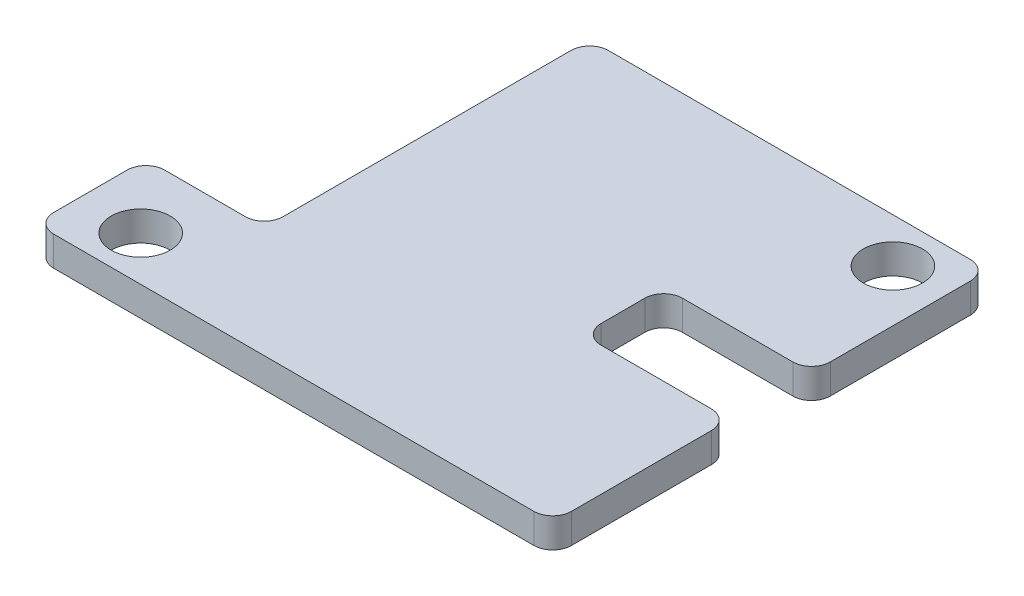
ISO-10303-21;
HEADER;
FILE_DESCRIPTION(('STEP AP214'),'2;1');
FILE_NAME('part.step','',(''),(''),'','','');
FILE_SCHEMA(('AUTOMOTIVE_DESIGN { 1 0 10303 214 1 1 1 1 }'));
ENDSEC;
DATA;
#1=APPLICATION_CONTEXT('core data for automotive mechanical design processes');
#2=APPLICATION_PROTOCOL_DEFINITION('international standard','automotive_design',2000,#1);
#3=PRODUCT_CONTEXT('',#1,'mechanical');
#4=PRODUCT('Part','Part','',(#3));
#5=PRODUCT_RELATED_PRODUCT_CATEGORY('part','',(#4));
#6=PRODUCT_DEFINITION_FORMATION('','',#4);
#7=PRODUCT_DEFINITION_CONTEXT('part definition',#1,'design');
#8=PRODUCT_DEFINITION('design','',#6,#7);
#9=PRODUCT_DEFINITION_SHAPE('','',#8);
#10=(LENGTH_UNIT() NAMED_UNIT(*) SI_UNIT(.MILLI.,.METRE.));
#11=(NAMED_UNIT(*) PLANE_ANGLE_UNIT() SI_UNIT($,.RADIAN.));
#12=(NAMED_UNIT(*) SI_UNIT($,.STERADIAN.) SOLID_ANGLE_UNIT());
#13=UNCERTAINTY_MEASURE_WITH_UNIT(LENGTH_MEASURE(1.E-05),#10,'distance_accuracy_value','');
#14=(GEOMETRIC_REPRESENTATION_CONTEXT(3) GLOBAL_UNCERTAINTY_ASSIGNED_CONTEXT((#13)) GLOBAL_UNIT_ASSIGNED_CONTEXT((#10,
#11,#12)) REPRESENTATION_CONTEXT('',''));
#15=CARTESIAN_POINT('',(0.,0.,0.));
#16=DIRECTION('',(0.,0.,1.));
#17=DIRECTION('',(1.,0.,0.));
#18=AXIS2_PLACEMENT_3D('',#15,#16,#17);
#19=CARTESIAN_POINT('',(0.,2.,0.));
#20=DIRECTION('',(0.,1.,0.));
#21=DIRECTION('',(0.,0.,1.));
#22=AXIS2_PLACEMENT_3D('',#19,#20,#21);
#23=PLANE('',#22);
#24=CARTESIAN_POINT('',(4.15,2.,-3.));
#25=DIRECTION('',(0.,1.,0.));
#26=DIRECTION('',(0.,0.,1.));
#27=AXIS2_PLACEMENT_3D('',#24,#25,#26);
#28=CIRCLE('',#27,2.);
#29=CARTESIAN_POINT('',(4.15,2.,-0.999999999999999));
#30=VERTEX_POINT('',#29);
#31=EDGE_CURVE('E328',#30,#30,#28,.T.);
#32=ORIENTED_EDGE('',*,*,#31,.F.);
#33=EDGE_LOOP('',(#32));
#34=FACE_BOUND('',#33,.T.);
#35=DIRECTION('',(-1.,0.,0.));
#36=VECTOR('',#35,1.);
#37=CARTESIAN_POINT('',(8.,2.,-29.5));
#38=LINE('',#37,#36);
#39=CARTESIAN_POINT('',(33.73,2.,-29.5));
#40=VERTEX_POINT('',#39);
#41=CARTESIAN_POINT('',(9.27,2.,-29.5));
#42=VERTEX_POINT('',#41);
#43=EDGE_CURVE('E320',#40,#42,#38,.T.);
#44=ORIENTED_EDGE('',*,*,#43,.T.);
#45=CARTESIAN_POINT('',(9.27,2.,-28.23));
#46=DIRECTION('',(0.,1.,0.));
#47=DIRECTION('',(0.,0.,1.));
#48=AXIS2_PLACEMENT_3D('',#45,#46,#47);
#49=CIRCLE('',#48,1.27);
#50=CARTESIAN_POINT('',(8.,2.,-28.23));
#51=VERTEX_POINT('',#50);
#52=EDGE_CURVE('E278',#42,#51,#49,.T.);
#53=ORIENTED_EDGE('',*,*,#52,.T.);
#54=DIRECTION('',(0.,0.,1.));
#55=VECTOR('',#54,1.);
#56=CARTESIAN_POINT('',(8.,2.,-29.5));
#57=LINE('',#56,#55);
#58=CARTESIAN_POINT('',(8.,2.,-8.77));
#59=VERTEX_POINT('',#58);
#60=EDGE_CURVE('E318',#51,#59,#57,.T.);
#61=ORIENTED_EDGE('',*,*,#60,.T.);
#62=CARTESIAN_POINT('',(6.73,2.,-8.77));
#63=DIRECTION('',(0.,1.,0.));
#64=DIRECTION('',(0.,0.,1.));
#65=AXIS2_PLACEMENT_3D('',#62,#63,#64);
#66=CIRCLE('',#65,1.27);
#67=CARTESIAN_POINT('',(6.73,2.,-7.5));
#68=VERTEX_POINT('',#67);
#69=EDGE_CURVE('E13',#59,#68,#66,.F.);
#70=ORIENTED_EDGE('',*,*,#69,.T.);
#71=DIRECTION('',(-1.,0.,0.));
#72=VECTOR('',#71,1.);
#73=CARTESIAN_POINT('',(8.,2.,-7.5));
#74=LINE('',#73,#72);
#75=CARTESIAN_POINT('',(1.27,2.,-7.5));
#76=VERTEX_POINT('',#75);
#77=EDGE_CURVE('E233',#68,#76,#74,.T.);
#78=ORIENTED_EDGE('',*,*,#77,.T.);
#79=CARTESIAN_POINT('',(1.27,2.,-6.23));
#80=DIRECTION('',(0.,1.,0.));
#81=DIRECTION('',(0.,0.,1.));
#82=AXIS2_PLACEMENT_3D('',#79,#80,#81);
#83=CIRCLE('',#82,1.27);
#84=CARTESIAN_POINT('',(0.,2.,-6.23));
#85=VERTEX_POINT('',#84);
#86=EDGE_CURVE('E276',#76,#85,#83,.T.);
#87=ORIENTED_EDGE('',*,*,#86,.T.);
#88=DIRECTION('',(0.,0.,1.));
#89=VECTOR('',#88,1.);
#90=CARTESIAN_POINT('',(0.,2.,0.));
#91=LINE('',#90,#89);
#92=CARTESIAN_POINT('',(0.,2.,-1.27));
#93=VERTEX_POINT('',#92);
#94=EDGE_CURVE('E232',#85,#93,#91,.T.);
#95=ORIENTED_EDGE('',*,*,#94,.T.);
#96=CARTESIAN_POINT('',(1.27,2.,-1.27));
#97=DIRECTION('',(0.,1.,0.));
#98=DIRECTION('',(0.,0.,1.));
#99=AXIS2_PLACEMENT_3D('',#96,#97,#98);
#100=CIRCLE('',#99,1.27);
#101=CARTESIAN_POINT('',(1.27,2.,0.));
#102=VERTEX_POINT('',#101);
#103=EDGE_CURVE('E268',#93,#102,#100,.T.);
#104=ORIENTED_EDGE('',*,*,#103,.T.);
#105=DIRECTION('',(1.,0.,0.));
#106=VECTOR('',#105,1.);
#107=CARTESIAN_POINT('',(0.,2.,0.));
#108=LINE('',#107,#106);
#109=CARTESIAN_POINT('',(33.73,2.,0.));
#110=VERTEX_POINT('',#109);
#111=EDGE_CURVE('E456',#102,#110,#108,.T.);
#112=ORIENTED_EDGE('',*,*,#111,.T.);
#113=CARTESIAN_POINT('',(33.73,2.,-1.27));
#114=DIRECTION('',(0.,1.,0.));
#115=DIRECTION('',(0.,0.,1.));
#116=AXIS2_PLACEMENT_3D('',#113,#114,#115);
#117=CIRCLE('',#116,1.27);
#118=CARTESIAN_POINT('',(35.,2.,-1.27));
#119=VERTEX_POINT('',#118);
#120=EDGE_CURVE('E274',#110,#119,#117,.T.);
#121=ORIENTED_EDGE('',*,*,#120,.T.);
#122=DIRECTION('',(0.,0.,-1.));
#123=VECTOR('',#122,1.);
#124=CARTESIAN_POINT('',(35.,2.,0.));
#125=LINE('',#124,#123);
#126=CARTESIAN_POINT('',(35.,2.,-10.73));
#127=VERTEX_POINT('',#126);
#128=EDGE_CURVE('E356',#119,#127,#125,.T.);
#129=ORIENTED_EDGE('',*,*,#128,.T.);
#130=CARTESIAN_POINT('',(33.73,2.,-10.73));
#131=DIRECTION('',(0.,1.,0.));
#132=DIRECTION('',(0.,0.,1.));
#133=AXIS2_PLACEMENT_3D('',#130,#131,#132);
#134=CIRCLE('',#133,1.27);
#135=CARTESIAN_POINT('',(33.73,2.,-12.));
#136=VERTEX_POINT('',#135);
#137=EDGE_CURVE('E272',#127,#136,#134,.T.);
#138=ORIENTED_EDGE('',*,*,#137,.T.);
#139=DIRECTION('',(-1.,0.,0.));
#140=VECTOR('',#139,1.);
#141=CARTESIAN_POINT('',(25.,2.,-12.));
#142=LINE('',#141,#140);
#143=CARTESIAN_POINT('',(26.27,2.,-12.));
#144=VERTEX_POINT('',#143);
#145=EDGE_CURVE('E350',#136,#144,#142,.T.);
#146=ORIENTED_EDGE('',*,*,#145,.T.);
#147=CARTESIAN_POINT('',(26.27,2.,-13.27));
#148=DIRECTION('',(0.,1.,0.));
#149=DIRECTION('',(0.,0.,1.));
#150=AXIS2_PLACEMENT_3D('',#147,#148,#149);
#151=CIRCLE('',#150,1.27);
#152=CARTESIAN_POINT('',(25.,2.,-13.27));
#153=VERTEX_POINT('',#152);
#154=EDGE_CURVE('E306',#144,#153,#151,.F.);
#155=ORIENTED_EDGE('',*,*,#154,.T.);
#156=DIRECTION('',(0.,0.,-1.));
#157=VECTOR('',#156,1.);
#158=CARTESIAN_POINT('',(25.,2.,-17.5));
#159=LINE('',#158,#157);
#160=CARTESIAN_POINT('',(25.,2.,-16.23));
#161=VERTEX_POINT('',#160);
#162=EDGE_CURVE('E349',#153,#161,#159,.T.);
#163=ORIENTED_EDGE('',*,*,#162,.T.);
#164=CARTESIAN_POINT('',(26.27,2.,-16.23));
#165=DIRECTION('',(0.,1.,0.));
#166=DIRECTION('',(0.,0.,1.));
#167=AXIS2_PLACEMENT_3D('',#164,#165,#166);
#168=CIRCLE('',#167,1.27);
#169=CARTESIAN_POINT('',(26.27,2.,-17.5));
#170=VERTEX_POINT('',#169);
#171=EDGE_CURVE('E196',#161,#170,#168,.F.);
#172=ORIENTED_EDGE('',*,*,#171,.T.);
#173=DIRECTION('',(1.,0.,0.));
#174=VECTOR('',#173,1.);
#175=CARTESIAN_POINT('',(35.,2.,-17.5));
#176=LINE('',#175,#174);
#177=CARTESIAN_POINT('',(33.73,2.,-17.5));
#178=VERTEX_POINT('',#177);
#179=EDGE_CURVE('E206',#170,#178,#176,.T.);
#180=ORIENTED_EDGE('',*,*,#179,.T.);
#181=CARTESIAN_POINT('',(33.73,2.,-18.77));
#182=DIRECTION('',(0.,1.,0.));
#183=DIRECTION('',(0.,0.,1.));
#184=AXIS2_PLACEMENT_3D('',#181,#182,#183);
#185=CIRCLE('',#184,1.27);
#186=CARTESIAN_POINT('',(35.,2.,-18.77));
#187=VERTEX_POINT('',#186);
#188=EDGE_CURVE('E270',#178,#187,#185,.T.);
#189=ORIENTED_EDGE('',*,*,#188,.T.);
#190=DIRECTION('',(0.,0.,-1.));
#191=VECTOR('',#190,1.);
#192=CARTESIAN_POINT('',(35.,2.,-17.5));
#193=LINE('',#192,#191);
#194=CARTESIAN_POINT('',(35.,2.,-28.23));
#195=VERTEX_POINT('',#194);
#196=EDGE_CURVE('E354',#187,#195,#193,.T.);
#197=ORIENTED_EDGE('',*,*,#196,.T.);
#198=CARTESIAN_POINT('',(33.73,2.,-28.23));
#199=DIRECTION('',(0.,1.,0.));
#200=DIRECTION('',(0.,0.,1.));
#201=AXIS2_PLACEMENT_3D('',#198,#199,#200);
#202=CIRCLE('',#201,1.27);
#203=EDGE_CURVE('E266',#195,#40,#202,.T.);
#204=ORIENTED_EDGE('',*,*,#203,.T.);
#205=EDGE_LOOP('',(#44,#53,#61,#70,#78,#87,#95,#104,#112,#121,#129,#138,#146,#155,#163,#172,
#180,#189,#197,#204));
#206=FACE_BOUND('',#205,.T.);
#207=CARTESIAN_POINT('',(31.5,2.,-26.5));
#208=DIRECTION('',(0.,1.,0.));
#209=DIRECTION('',(0.,0.,1.));
#210=AXIS2_PLACEMENT_3D('',#207,#208,#209);
#211=CIRCLE('',#210,2.);
#212=CARTESIAN_POINT('',(31.5,2.,-24.5));
#213=VERTEX_POINT('',#212);
#214=EDGE_CURVE('E466',#213,#213,#211,.T.);
#215=ORIENTED_EDGE('',*,*,#214,.F.);
#216=EDGE_LOOP('',(#215));
#217=FACE_BOUND('',#216,.T.);
#218=ADVANCED_FACE('F49',(#34,#206,#217),#23,.T.);
#219=CARTESIAN_POINT('',(0.,0.,0.));
#220=DIRECTION('',(0.,1.,0.));
#221=DIRECTION('',(0.,0.,1.));
#222=AXIS2_PLACEMENT_3D('',#219,#220,#221);
#223=PLANE('',#222);
#224=CARTESIAN_POINT('',(4.15,0.,-3.));
#225=DIRECTION('',(0.,1.,0.));
#226=DIRECTION('',(0.,0.,1.));
#227=AXIS2_PLACEMENT_3D('',#224,#225,#226);
#228=CIRCLE('',#227,2.);
#229=CARTESIAN_POINT('',(4.15,0.,-0.999999999999999));
#230=VERTEX_POINT('',#229);
#231=EDGE_CURVE('E463',#230,#230,#228,.T.);
#232=ORIENTED_EDGE('',*,*,#231,.T.);
#233=EDGE_LOOP('',(#232));
#234=FACE_BOUND('',#233,.T.);
#235=DIRECTION('',(0.,0.,1.));
#236=VECTOR('',#235,1.);
#237=CARTESIAN_POINT('',(8.,0.,-29.5));
#238=LINE('',#237,#236);
#239=CARTESIAN_POINT('',(8.,0.,-28.23));
#240=VERTEX_POINT('',#239);
#241=CARTESIAN_POINT('',(8.,0.,-8.77));
#242=VERTEX_POINT('',#241);
#243=EDGE_CURVE('E227',#240,#242,#238,.T.);
#244=ORIENTED_EDGE('',*,*,#243,.F.);
#245=CARTESIAN_POINT('',(9.27,0.,-28.23));
#246=DIRECTION('',(0.,1.,0.));
#247=DIRECTION('',(0.,0.,1.));
#248=AXIS2_PLACEMENT_3D('',#245,#246,#247);
#249=CIRCLE('',#248,1.27);
#250=CARTESIAN_POINT('',(9.27,0.,-29.5));
#251=VERTEX_POINT('',#250);
#252=EDGE_CURVE('E259',#240,#251,#249,.F.);
#253=ORIENTED_EDGE('',*,*,#252,.T.);
#254=DIRECTION('',(-1.,0.,0.));
#255=VECTOR('',#254,1.);
#256=CARTESIAN_POINT('',(8.,0.,-29.5));
#257=LINE('',#256,#255);
#258=CARTESIAN_POINT('',(33.73,0.,-29.5));
#259=VERTEX_POINT('',#258);
#260=EDGE_CURVE('E219',#259,#251,#257,.T.);
#261=ORIENTED_EDGE('',*,*,#260,.F.);
#262=CARTESIAN_POINT('',(33.73,0.,-28.23));
#263=DIRECTION('',(0.,1.,0.));
#264=DIRECTION('',(0.,0.,1.));
#265=AXIS2_PLACEMENT_3D('',#262,#263,#264);
#266=CIRCLE('',#265,1.27);
#267=CARTESIAN_POINT('',(35.,0.,-28.23));
#268=VERTEX_POINT('',#267);
#269=EDGE_CURVE('E248',#259,#268,#266,.F.);
#270=ORIENTED_EDGE('',*,*,#269,.T.);
#271=DIRECTION('',(0.,0.,-1.));
#272=VECTOR('',#271,1.);
#273=CARTESIAN_POINT('',(35.,0.,-17.5));
#274=LINE('',#273,#272);
#275=CARTESIAN_POINT('',(35.,0.,-18.77));
#276=VERTEX_POINT('',#275);
#277=EDGE_CURVE('E215',#276,#268,#274,.T.);
#278=ORIENTED_EDGE('',*,*,#277,.F.);
#279=CARTESIAN_POINT('',(33.73,0.,-18.77));
#280=DIRECTION('',(0.,1.,0.));
#281=DIRECTION('',(0.,0.,1.));
#282=AXIS2_PLACEMENT_3D('',#279,#280,#281);
#283=CIRCLE('',#282,1.27);
#284=CARTESIAN_POINT('',(33.73,0.,-17.5));
#285=VERTEX_POINT('',#284);
#286=EDGE_CURVE('E214',#276,#285,#283,.F.);
#287=ORIENTED_EDGE('',*,*,#286,.T.);
#288=DIRECTION('',(1.,0.,0.));
#289=VECTOR('',#288,1.);
#290=CARTESIAN_POINT('',(35.,0.,-17.5));
#291=LINE('',#290,#289);
#292=CARTESIAN_POINT('',(26.27,0.,-17.5));
#293=VERTEX_POINT('',#292);
#294=EDGE_CURVE('E203',#293,#285,#291,.T.);
#295=ORIENTED_EDGE('',*,*,#294,.F.);
#296=CARTESIAN_POINT('',(26.27,0.,-16.23));
#297=DIRECTION('',(0.,1.,0.));
#298=DIRECTION('',(0.,0.,1.));
#299=AXIS2_PLACEMENT_3D('',#296,#297,#298);
#300=CIRCLE('',#299,1.27);
#301=CARTESIAN_POINT('',(25.,0.,-16.23));
#302=VERTEX_POINT('',#301);
#303=EDGE_CURVE('E186',#293,#302,#300,.T.);
#304=ORIENTED_EDGE('',*,*,#303,.T.);
#305=DIRECTION('',(0.,0.,-1.));
#306=VECTOR('',#305,1.);
#307=CARTESIAN_POINT('',(25.,0.,-17.5));
#308=LINE('',#307,#306);
#309=CARTESIAN_POINT('',(25.,0.,-13.27));
#310=VERTEX_POINT('',#309);
#311=EDGE_CURVE('E216',#310,#302,#308,.T.);
#312=ORIENTED_EDGE('',*,*,#311,.F.);
#313=CARTESIAN_POINT('',(26.27,0.,-13.27));
#314=DIRECTION('',(0.,1.,0.));
#315=DIRECTION('',(0.,0.,1.));
#316=AXIS2_PLACEMENT_3D('',#313,#314,#315);
#317=CIRCLE('',#316,1.27);
#318=CARTESIAN_POINT('',(26.27,0.,-12.));
#319=VERTEX_POINT('',#318);
#320=EDGE_CURVE('E304',#310,#319,#317,.T.);
#321=ORIENTED_EDGE('',*,*,#320,.T.);
#322=DIRECTION('',(-1.,0.,0.));
#323=VECTOR('',#322,1.);
#324=CARTESIAN_POINT('',(25.,0.,-12.));
#325=LINE('',#324,#323);
#326=CARTESIAN_POINT('',(33.73,0.,-12.));
#327=VERTEX_POINT('',#326);
#328=EDGE_CURVE('E221',#327,#319,#325,.T.);
#329=ORIENTED_EDGE('',*,*,#328,.F.);
#330=CARTESIAN_POINT('',(33.73,0.,-10.73));
#331=DIRECTION('',(0.,1.,0.));
#332=DIRECTION('',(0.,0.,1.));
#333=AXIS2_PLACEMENT_3D('',#330,#331,#332);
#334=CIRCLE('',#333,1.27);
#335=CARTESIAN_POINT('',(35.,0.,-10.73));
#336=VERTEX_POINT('',#335);
#337=EDGE_CURVE('E253',#327,#336,#334,.F.);
#338=ORIENTED_EDGE('',*,*,#337,.T.);
#339=DIRECTION('',(0.,0.,-1.));
#340=VECTOR('',#339,1.);
#341=CARTESIAN_POINT('',(35.,0.,0.));
#342=LINE('',#341,#340);
#343=CARTESIAN_POINT('',(35.,0.,-1.27));
#344=VERTEX_POINT('',#343);
#345=EDGE_CURVE('E331',#344,#336,#342,.T.);
#346=ORIENTED_EDGE('',*,*,#345,.F.);
#347=CARTESIAN_POINT('',(33.73,0.,-1.27));
#348=DIRECTION('',(0.,1.,0.));
#349=DIRECTION('',(0.,0.,1.));
#350=AXIS2_PLACEMENT_3D('',#347,#348,#349);
#351=CIRCLE('',#350,1.27);
#352=CARTESIAN_POINT('',(33.73,0.,0.));
#353=VERTEX_POINT('',#352);
#354=EDGE_CURVE('E255',#344,#353,#351,.F.);
#355=ORIENTED_EDGE('',*,*,#354,.T.);
#356=DIRECTION('',(1.,0.,0.));
#357=VECTOR('',#356,1.);
#358=CARTESIAN_POINT('',(0.,0.,0.));
#359=LINE('',#358,#357);
#360=CARTESIAN_POINT('',(1.27,0.,0.));
#361=VERTEX_POINT('',#360);
#362=EDGE_CURVE('E327',#361,#353,#359,.T.);
#363=ORIENTED_EDGE('',*,*,#362,.F.);
#364=CARTESIAN_POINT('',(1.27,0.,-1.27));
#365=DIRECTION('',(0.,1.,0.));
#366=DIRECTION('',(0.,0.,1.));
#367=AXIS2_PLACEMENT_3D('',#364,#365,#366);
#368=CIRCLE('',#367,1.27);
#369=CARTESIAN_POINT('',(0.,0.,-1.27));
#370=VERTEX_POINT('',#369);
#371=EDGE_CURVE('E250',#361,#370,#368,.F.);
#372=ORIENTED_EDGE('',*,*,#371,.T.);
#373=DIRECTION('',(0.,0.,1.));
#374=VECTOR('',#373,1.);
#375=CARTESIAN_POINT('',(0.,0.,0.));
#376=LINE('',#375,#374);
#377=CARTESIAN_POINT('',(0.,0.,-6.23));
#378=VERTEX_POINT('',#377);
#379=EDGE_CURVE('E324',#378,#370,#376,.T.);
#380=ORIENTED_EDGE('',*,*,#379,.F.);
#381=CARTESIAN_POINT('',(1.27,0.,-6.23));
#382=DIRECTION('',(0.,1.,0.));
#383=DIRECTION('',(0.,0.,1.));
#384=AXIS2_PLACEMENT_3D('',#381,#382,#383);
#385=CIRCLE('',#384,1.27);
#386=CARTESIAN_POINT('',(1.27,0.,-7.5));
#387=VERTEX_POINT('',#386);
#388=EDGE_CURVE('E257',#378,#387,#385,.F.);
#389=ORIENTED_EDGE('',*,*,#388,.T.);
#390=DIRECTION('',(-1.,0.,0.));
#391=VECTOR('',#390,1.);
#392=CARTESIAN_POINT('',(8.,0.,-7.5));
#393=LINE('',#392,#391);
#394=CARTESIAN_POINT('',(6.73,0.,-7.5));
#395=VERTEX_POINT('',#394);
#396=EDGE_CURVE('E230',#395,#387,#393,.T.);
#397=ORIENTED_EDGE('',*,*,#396,.F.);
#398=CARTESIAN_POINT('',(6.73,0.,-8.77));
#399=DIRECTION('',(0.,1.,0.));
#400=DIRECTION('',(0.,0.,1.));
#401=AXIS2_PLACEMENT_3D('',#398,#399,#400);
#402=CIRCLE('',#401,1.27);
#403=EDGE_CURVE('E57',#395,#242,#402,.T.);
#404=ORIENTED_EDGE('',*,*,#403,.T.);
#405=EDGE_LOOP('',(#244,#253,#261,#270,#278,#287,#295,#304,#312,#321,#329,#338,#346,#355,#363,
#372,#380,#389,#397,#404));
#406=FACE_BOUND('',#405,.T.);
#407=CARTESIAN_POINT('',(31.5,0.,-26.5));
#408=DIRECTION('',(0.,1.,0.));
#409=DIRECTION('',(0.,0.,1.));
#410=AXIS2_PLACEMENT_3D('',#407,#408,#409);
#411=CIRCLE('',#410,2.);
#412=CARTESIAN_POINT('',(31.5,0.,-24.5));
#413=VERTEX_POINT('',#412);
#414=EDGE_CURVE('E469',#413,#413,#411,.T.);
#415=ORIENTED_EDGE('',*,*,#414,.T.);
#416=EDGE_LOOP('',(#415));
#417=FACE_BOUND('',#416,.T.);
#418=ADVANCED_FACE('F211',(#234,#406,#417),#223,.F.);
#419=CARTESIAN_POINT('',(0.,2.,0.));
#420=DIRECTION('',(1.,0.,0.));
#421=DIRECTION('',(0.,0.,-1.));
#422=AXIS2_PLACEMENT_3D('',#419,#420,#421);
#423=PLANE('',#422);
#424=ORIENTED_EDGE('',*,*,#94,.F.);
#425=DIRECTION('',(0.,-1.,0.));
#426=VECTOR('',#425,1.);
#427=CARTESIAN_POINT('',(0.,2.,-6.23));
#428=LINE('',#427,#426);
#429=EDGE_CURVE('E286',#85,#378,#428,.T.);
#430=ORIENTED_EDGE('',*,*,#429,.T.);
#431=ORIENTED_EDGE('',*,*,#379,.T.);
#432=DIRECTION('',(0.,-1.,0.));
#433=VECTOR('',#432,1.);
#434=CARTESIAN_POINT('',(0.,2.,-1.27));
#435=LINE('',#434,#433);
#436=EDGE_CURVE('E284',#370,#93,#435,.F.);
#437=ORIENTED_EDGE('',*,*,#436,.T.);
#438=EDGE_LOOP('',(#424,#430,#431,#437));
#439=FACE_BOUND('',#438,.T.);
#440=ADVANCED_FACE('F398',(#439),#423,.F.);
#441=CARTESIAN_POINT('',(0.,2.,0.));
#442=DIRECTION('',(0.,0.,-1.));
#443=DIRECTION('',(-1.,0.,0.));
#444=AXIS2_PLACEMENT_3D('',#441,#442,#443);
#445=PLANE('',#444);
#446=ORIENTED_EDGE('',*,*,#362,.T.);
#447=DIRECTION('',(0.,-1.,0.));
#448=VECTOR('',#447,1.);
#449=CARTESIAN_POINT('',(33.73,2.,0.));
#450=LINE('',#449,#448);
#451=EDGE_CURVE('E297',#353,#110,#450,.F.);
#452=ORIENTED_EDGE('',*,*,#451,.T.);
#453=ORIENTED_EDGE('',*,*,#111,.F.);
#454=DIRECTION('',(0.,-1.,0.));
#455=VECTOR('',#454,1.);
#456=CARTESIAN_POINT('',(1.27,2.,0.));
#457=LINE('',#456,#455);
#458=EDGE_CURVE('E294',#102,#361,#457,.T.);
#459=ORIENTED_EDGE('',*,*,#458,.T.);
#460=EDGE_LOOP('',(#446,#452,#453,#459));
#461=FACE_BOUND('',#460,.T.);
#462=ADVANCED_FACE('F423',(#461),#445,.F.);
#463=CARTESIAN_POINT('',(35.,2.,0.));
#464=DIRECTION('',(-1.,0.,0.));
#465=DIRECTION('',(0.,0.,1.));
#466=AXIS2_PLACEMENT_3D('',#463,#464,#465);
#467=PLANE('',#466);
#468=ORIENTED_EDGE('',*,*,#128,.F.);
#469=DIRECTION('',(0.,-1.,0.));
#470=VECTOR('',#469,1.);
#471=CARTESIAN_POINT('',(35.,2.,-1.27));
#472=LINE('',#471,#470);
#473=EDGE_CURVE('E291',#119,#344,#472,.T.);
#474=ORIENTED_EDGE('',*,*,#473,.T.);
#475=ORIENTED_EDGE('',*,*,#345,.T.);
#476=DIRECTION('',(0.,-1.,0.));
#477=VECTOR('',#476,1.);
#478=CARTESIAN_POINT('',(35.,2.,-10.73));
#479=LINE('',#478,#477);
#480=EDGE_CURVE('E289',#336,#127,#479,.F.);
#481=ORIENTED_EDGE('',*,*,#480,.T.);
#482=EDGE_LOOP('',(#468,#474,#475,#481));
#483=FACE_BOUND('',#482,.T.);
#484=ADVANCED_FACE('F420',(#483),#467,.F.);
#485=CARTESIAN_POINT('',(25.,2.,-12.));
#486=DIRECTION('',(0.,0.,1.));
#487=DIRECTION('',(1.,0.,0.));
#488=AXIS2_PLACEMENT_3D('',#485,#486,#487);
#489=PLANE('',#488);
#490=ORIENTED_EDGE('',*,*,#328,.T.);
#491=DIRECTION('',(0.,-1.,0.));
#492=VECTOR('',#491,1.);
#493=CARTESIAN_POINT('',(26.27,2.,-12.));
#494=LINE('',#493,#492);
#495=EDGE_CURVE('E241',#319,#144,#494,.F.);
#496=ORIENTED_EDGE('',*,*,#495,.T.);
#497=ORIENTED_EDGE('',*,*,#145,.F.);
#498=DIRECTION('',(0.,-1.,0.));
#499=VECTOR('',#498,1.);
#500=CARTESIAN_POINT('',(33.73,2.,-12.));
#501=LINE('',#500,#499);
#502=EDGE_CURVE('E238',#136,#327,#501,.T.);
#503=ORIENTED_EDGE('',*,*,#502,.T.);
#504=EDGE_LOOP('',(#490,#496,#497,#503));
#505=FACE_BOUND('',#504,.T.);
#506=ADVANCED_FACE('F337',(#505),#489,.F.);
#507=CARTESIAN_POINT('',(25.,2.,-17.5));
#508=DIRECTION('',(-1.,0.,0.));
#509=DIRECTION('',(0.,0.,1.));
#510=AXIS2_PLACEMENT_3D('',#507,#508,#509);
#511=PLANE('',#510);
#512=ORIENTED_EDGE('',*,*,#311,.T.);
#513=DIRECTION('',(0.,-1.,0.));
#514=VECTOR('',#513,1.);
#515=CARTESIAN_POINT('',(25.,2.,-16.23));
#516=LINE('',#515,#514);
#517=EDGE_CURVE('E191',#302,#161,#516,.F.);
#518=ORIENTED_EDGE('',*,*,#517,.T.);
#519=ORIENTED_EDGE('',*,*,#162,.F.);
#520=DIRECTION('',(0.,-1.,0.));
#521=VECTOR('',#520,1.);
#522=CARTESIAN_POINT('',(25.,0.,-13.27));
#523=LINE('',#522,#521);
#524=EDGE_CURVE('E207',#153,#310,#523,.T.);
#525=ORIENTED_EDGE('',*,*,#524,.T.);
#526=EDGE_LOOP('',(#512,#518,#519,#525));
#527=FACE_BOUND('',#526,.T.);
#528=ADVANCED_FACE('F352',(#527),#511,.F.);
#529=CARTESIAN_POINT('',(35.,2.,-17.5));
#530=DIRECTION('',(0.,0.,-1.));
#531=DIRECTION('',(-1.,0.,0.));
#532=AXIS2_PLACEMENT_3D('',#529,#530,#531);
#533=PLANE('',#532);
#534=ORIENTED_EDGE('',*,*,#179,.F.);
#535=DIRECTION('',(0.,-1.,0.));
#536=VECTOR('',#535,1.);
#537=CARTESIAN_POINT('',(26.27,0.,-17.5));
#538=LINE('',#537,#536);
#539=EDGE_CURVE('E190',#170,#293,#538,.T.);
#540=ORIENTED_EDGE('',*,*,#539,.T.);
#541=ORIENTED_EDGE('',*,*,#294,.T.);
#542=DIRECTION('',(0.,-1.,0.));
#543=VECTOR('',#542,1.);
#544=CARTESIAN_POINT('',(33.73,2.,-17.5));
#545=LINE('',#544,#543);
#546=EDGE_CURVE('E208',#285,#178,#545,.F.);
#547=ORIENTED_EDGE('',*,*,#546,.T.);
#548=EDGE_LOOP('',(#534,#540,#541,#547));
#549=FACE_BOUND('',#548,.T.);
#550=ADVANCED_FACE('F202',(#549),#533,.F.);
#551=CARTESIAN_POINT('',(35.,2.,-17.5));
#552=DIRECTION('',(-1.,0.,0.));
#553=DIRECTION('',(0.,0.,1.));
#554=AXIS2_PLACEMENT_3D('',#551,#552,#553);
#555=PLANE('',#554);
#556=ORIENTED_EDGE('',*,*,#196,.F.);
#557=DIRECTION('',(0.,-1.,0.));
#558=VECTOR('',#557,1.);
#559=CARTESIAN_POINT('',(35.,2.,-18.77));
#560=LINE('',#559,#558);
#561=EDGE_CURVE('E197',#187,#276,#560,.T.);
#562=ORIENTED_EDGE('',*,*,#561,.T.);
#563=ORIENTED_EDGE('',*,*,#277,.T.);
#564=DIRECTION('',(0.,-1.,0.));
#565=VECTOR('',#564,1.);
#566=CARTESIAN_POINT('',(35.,2.,-28.23));
#567=LINE('',#566,#565);
#568=EDGE_CURVE('E299',#268,#195,#567,.F.);
#569=ORIENTED_EDGE('',*,*,#568,.T.);
#570=EDGE_LOOP('',(#556,#562,#563,#569));
#571=FACE_BOUND('',#570,.T.);
#572=ADVANCED_FACE('F375',(#571),#555,.F.);
#573=CARTESIAN_POINT('',(8.,2.,-29.5));
#574=DIRECTION('',(0.,0.,1.));
#575=DIRECTION('',(1.,0.,0.));
#576=AXIS2_PLACEMENT_3D('',#573,#574,#575);
#577=PLANE('',#576);
#578=ORIENTED_EDGE('',*,*,#260,.T.);
#579=DIRECTION('',(0.,-1.,0.));
#580=VECTOR('',#579,1.);
#581=CARTESIAN_POINT('',(9.27,2.,-29.5));
#582=LINE('',#581,#580);
#583=EDGE_CURVE('E264',#251,#42,#582,.F.);
#584=ORIENTED_EDGE('',*,*,#583,.T.);
#585=ORIENTED_EDGE('',*,*,#43,.F.);
#586=DIRECTION('',(0.,-1.,0.));
#587=VECTOR('',#586,1.);
#588=CARTESIAN_POINT('',(33.73,2.,-29.5));
#589=LINE('',#588,#587);
#590=EDGE_CURVE('E261',#40,#259,#589,.T.);
#591=ORIENTED_EDGE('',*,*,#590,.T.);
#592=EDGE_LOOP('',(#578,#584,#585,#591));
#593=FACE_BOUND('',#592,.T.);
#594=ADVANCED_FACE('F370',(#593),#577,.F.);
#595=CARTESIAN_POINT('',(8.,2.,-29.5));
#596=DIRECTION('',(1.,0.,0.));
#597=DIRECTION('',(0.,0.,-1.));
#598=AXIS2_PLACEMENT_3D('',#595,#596,#597);
#599=PLANE('',#598);
#600=ORIENTED_EDGE('',*,*,#60,.F.);
#601=DIRECTION('',(0.,-1.,0.));
#602=VECTOR('',#601,1.);
#603=CARTESIAN_POINT('',(8.,2.,-28.23));
#604=LINE('',#603,#602);
#605=EDGE_CURVE('E245',#51,#240,#604,.T.);
#606=ORIENTED_EDGE('',*,*,#605,.T.);
#607=ORIENTED_EDGE('',*,*,#243,.T.);
#608=DIRECTION('',(0.,-1.,0.));
#609=VECTOR('',#608,1.);
#610=CARTESIAN_POINT('',(8.,2.,-8.77));
#611=LINE('',#610,#609);
#612=EDGE_CURVE('E243',#242,#59,#611,.F.);
#613=ORIENTED_EDGE('',*,*,#612,.T.);
#614=EDGE_LOOP('',(#600,#606,#607,#613));
#615=FACE_BOUND('',#614,.T.);
#616=ADVANCED_FACE('F313',(#615),#599,.F.);
#617=CARTESIAN_POINT('',(8.,2.,-7.5));
#618=DIRECTION('',(0.,0.,1.));
#619=DIRECTION('',(1.,0.,0.));
#620=AXIS2_PLACEMENT_3D('',#617,#618,#619);
#621=PLANE('',#620);
#622=ORIENTED_EDGE('',*,*,#77,.F.);
#623=DIRECTION('',(0.,-1.,0.));
#624=VECTOR('',#623,1.);
#625=CARTESIAN_POINT('',(6.73,0.,-7.5));
#626=LINE('',#625,#624);
#627=EDGE_CURVE('E281',#68,#395,#626,.T.);
#628=ORIENTED_EDGE('',*,*,#627,.T.);
#629=ORIENTED_EDGE('',*,*,#396,.T.);
#630=DIRECTION('',(0.,-1.,0.));
#631=VECTOR('',#630,1.);
#632=CARTESIAN_POINT('',(1.27,2.,-7.5));
#633=LINE('',#632,#631);
#634=EDGE_CURVE('E64',#387,#76,#633,.F.);
#635=ORIENTED_EDGE('',*,*,#634,.T.);
#636=EDGE_LOOP('',(#622,#628,#629,#635));
#637=FACE_BOUND('',#636,.T.);
#638=ADVANCED_FACE('F316',(#637),#621,.F.);
#639=CARTESIAN_POINT('',(4.15,2.,-3.));
#640=DIRECTION('',(0.,-1.,0.));
#641=DIRECTION('',(0.,0.,-1.));
#642=AXIS2_PLACEMENT_3D('',#639,#640,#641);
#643=CYLINDRICAL_SURFACE('',#642,2.);
#644=ORIENTED_EDGE('',*,*,#31,.T.);
#645=EDGE_LOOP('',(#644));
#646=FACE_BOUND('',#645,.T.);
#647=ORIENTED_EDGE('',*,*,#231,.F.);
#648=EDGE_LOOP('',(#647));
#649=FACE_BOUND('',#648,.T.);
#650=ADVANCED_FACE('F403',(#646,#649),#643,.F.);
#651=CARTESIAN_POINT('',(31.5,2.,-26.5));
#652=DIRECTION('',(0.,-1.,0.));
#653=DIRECTION('',(0.,0.,-1.));
#654=AXIS2_PLACEMENT_3D('',#651,#652,#653);
#655=CYLINDRICAL_SURFACE('',#654,2.);
#656=ORIENTED_EDGE('',*,*,#214,.T.);
#657=EDGE_LOOP('',(#656));
#658=FACE_BOUND('',#657,.T.);
#659=ORIENTED_EDGE('',*,*,#414,.F.);
#660=EDGE_LOOP('',(#659));
#661=FACE_BOUND('',#660,.T.);
#662=ADVANCED_FACE('F433',(#658,#661),#655,.F.);
#663=CARTESIAN_POINT('',(26.27,2.,-16.23));
#664=DIRECTION('',(0.,1.,0.));
#665=DIRECTION('',(0.,0.,1.));
#666=AXIS2_PLACEMENT_3D('',#663,#664,#665);
#667=CYLINDRICAL_SURFACE('',#666,1.27);
#668=ORIENTED_EDGE('',*,*,#171,.F.);
#669=ORIENTED_EDGE('',*,*,#517,.F.);
#670=ORIENTED_EDGE('',*,*,#303,.F.);
#671=ORIENTED_EDGE('',*,*,#539,.F.);
#672=EDGE_LOOP('',(#668,#669,#670,#671));
#673=FACE_BOUND('',#672,.T.);
#674=ADVANCED_FACE('F189',(#673),#667,.F.);
#675=CARTESIAN_POINT('',(26.27,2.,-13.27));
#676=DIRECTION('',(0.,1.,0.));
#677=DIRECTION('',(0.,0.,1.));
#678=AXIS2_PLACEMENT_3D('',#675,#676,#677);
#679=CYLINDRICAL_SURFACE('',#678,1.27);
#680=ORIENTED_EDGE('',*,*,#154,.F.);
#681=ORIENTED_EDGE('',*,*,#495,.F.);
#682=ORIENTED_EDGE('',*,*,#320,.F.);
#683=ORIENTED_EDGE('',*,*,#524,.F.);
#684=EDGE_LOOP('',(#680,#681,#682,#683));
#685=FACE_BOUND('',#684,.T.);
#686=ADVANCED_FACE('F343',(#685),#679,.F.);
#687=CARTESIAN_POINT('',(9.27,2.,-28.23));
#688=DIRECTION('',(0.,-1.,0.));
#689=DIRECTION('',(0.,0.,-1.));
#690=AXIS2_PLACEMENT_3D('',#687,#688,#689);
#691=CYLINDRICAL_SURFACE('',#690,1.27);
#692=ORIENTED_EDGE('',*,*,#52,.F.);
#693=ORIENTED_EDGE('',*,*,#583,.F.);
#694=ORIENTED_EDGE('',*,*,#252,.F.);
#695=ORIENTED_EDGE('',*,*,#605,.F.);
#696=EDGE_LOOP('',(#692,#693,#694,#695));
#697=FACE_BOUND('',#696,.T.);
#698=ADVANCED_FACE('F368',(#697),#691,.T.);
#699=CARTESIAN_POINT('',(6.73,2.,-8.77));
#700=DIRECTION('',(0.,1.,0.));
#701=DIRECTION('',(0.,0.,1.));
#702=AXIS2_PLACEMENT_3D('',#699,#700,#701);
#703=CYLINDRICAL_SURFACE('',#702,1.27);
#704=ORIENTED_EDGE('',*,*,#69,.F.);
#705=ORIENTED_EDGE('',*,*,#612,.F.);
#706=ORIENTED_EDGE('',*,*,#403,.F.);
#707=ORIENTED_EDGE('',*,*,#627,.F.);
#708=EDGE_LOOP('',(#704,#705,#706,#707));
#709=FACE_BOUND('',#708,.T.);
#710=ADVANCED_FACE('F315',(#709),#703,.F.);
#711=CARTESIAN_POINT('',(1.27,2.,-6.23));
#712=DIRECTION('',(0.,-1.,0.));
#713=DIRECTION('',(0.,0.,-1.));
#714=AXIS2_PLACEMENT_3D('',#711,#712,#713);
#715=CYLINDRICAL_SURFACE('',#714,1.27);
#716=ORIENTED_EDGE('',*,*,#86,.F.);
#717=ORIENTED_EDGE('',*,*,#634,.F.);
#718=ORIENTED_EDGE('',*,*,#388,.F.);
#719=ORIENTED_EDGE('',*,*,#429,.F.);
#720=EDGE_LOOP('',(#716,#717,#718,#719));
#721=FACE_BOUND('',#720,.T.);
#722=ADVANCED_FACE('F440',(#721),#715,.T.);
#723=CARTESIAN_POINT('',(33.73,2.,-1.27));
#724=DIRECTION('',(0.,-1.,0.));
#725=DIRECTION('',(0.,0.,-1.));
#726=AXIS2_PLACEMENT_3D('',#723,#724,#725);
#727=CYLINDRICAL_SURFACE('',#726,1.27);
#728=ORIENTED_EDGE('',*,*,#120,.F.);
#729=ORIENTED_EDGE('',*,*,#451,.F.);
#730=ORIENTED_EDGE('',*,*,#354,.F.);
#731=ORIENTED_EDGE('',*,*,#473,.F.);
#732=EDGE_LOOP('',(#728,#729,#730,#731));
#733=FACE_BOUND('',#732,.T.);
#734=ADVANCED_FACE('F389',(#733),#727,.T.);
#735=CARTESIAN_POINT('',(33.73,2.,-10.73));
#736=DIRECTION('',(0.,-1.,0.));
#737=DIRECTION('',(0.,0.,-1.));
#738=AXIS2_PLACEMENT_3D('',#735,#736,#737);
#739=CYLINDRICAL_SURFACE('',#738,1.27);
#740=ORIENTED_EDGE('',*,*,#137,.F.);
#741=ORIENTED_EDGE('',*,*,#480,.F.);
#742=ORIENTED_EDGE('',*,*,#337,.F.);
#743=ORIENTED_EDGE('',*,*,#502,.F.);
#744=EDGE_LOOP('',(#740,#741,#742,#743));
#745=FACE_BOUND('',#744,.T.);
#746=ADVANCED_FACE('F382',(#745),#739,.T.);
#747=CARTESIAN_POINT('',(33.73,2.,-18.77));
#748=DIRECTION('',(0.,-1.,0.));
#749=DIRECTION('',(0.,0.,-1.));
#750=AXIS2_PLACEMENT_3D('',#747,#748,#749);
#751=CYLINDRICAL_SURFACE('',#750,1.27);
#752=ORIENTED_EDGE('',*,*,#188,.F.);
#753=ORIENTED_EDGE('',*,*,#546,.F.);
#754=ORIENTED_EDGE('',*,*,#286,.F.);
#755=ORIENTED_EDGE('',*,*,#561,.F.);
#756=EDGE_LOOP('',(#752,#753,#754,#755));
#757=FACE_BOUND('',#756,.T.);
#758=ADVANCED_FACE('F379',(#757),#751,.T.);
#759=CARTESIAN_POINT('',(1.27,2.,-1.27));
#760=DIRECTION('',(0.,-1.,0.));
#761=DIRECTION('',(0.,0.,-1.));
#762=AXIS2_PLACEMENT_3D('',#759,#760,#761);
#763=CYLINDRICAL_SURFACE('',#762,1.27);
#764=ORIENTED_EDGE('',*,*,#103,.F.);
#765=ORIENTED_EDGE('',*,*,#436,.F.);
#766=ORIENTED_EDGE('',*,*,#371,.F.);
#767=ORIENTED_EDGE('',*,*,#458,.F.);
#768=EDGE_LOOP('',(#764,#765,#766,#767));
#769=FACE_BOUND('',#768,.T.);
#770=ADVANCED_FACE('F381',(#769),#763,.T.);
#771=CARTESIAN_POINT('',(33.73,2.,-28.23));
#772=DIRECTION('',(0.,-1.,0.));
#773=DIRECTION('',(0.,0.,-1.));
#774=AXIS2_PLACEMENT_3D('',#771,#772,#773);
#775=CYLINDRICAL_SURFACE('',#774,1.27);
#776=ORIENTED_EDGE('',*,*,#203,.F.);
#777=ORIENTED_EDGE('',*,*,#568,.F.);
#778=ORIENTED_EDGE('',*,*,#269,.F.);
#779=ORIENTED_EDGE('',*,*,#590,.F.);
#780=EDGE_LOOP('',(#776,#777,#778,#779));
#781=FACE_BOUND('',#780,.T.);
#782=ADVANCED_FACE('F51',(#781),#775,.T.);
#783=CLOSED_SHELL('',(#218,#418,#440,#462,#484,#506,#528,#550,#572,#594,#616,#638,#650,#662,
#674,#686,#698,#710,#722,#734,#746,#758,#770,#782));
#784=MANIFOLD_SOLID_BREP('B2',#783);
#785=ADVANCED_BREP_SHAPE_REPRESENTATION('',(#18,#784),#14);
#786=SHAPE_DEFINITION_REPRESENTATION(#9,#785);
ENDSEC;
END-ISO-10303-21;
